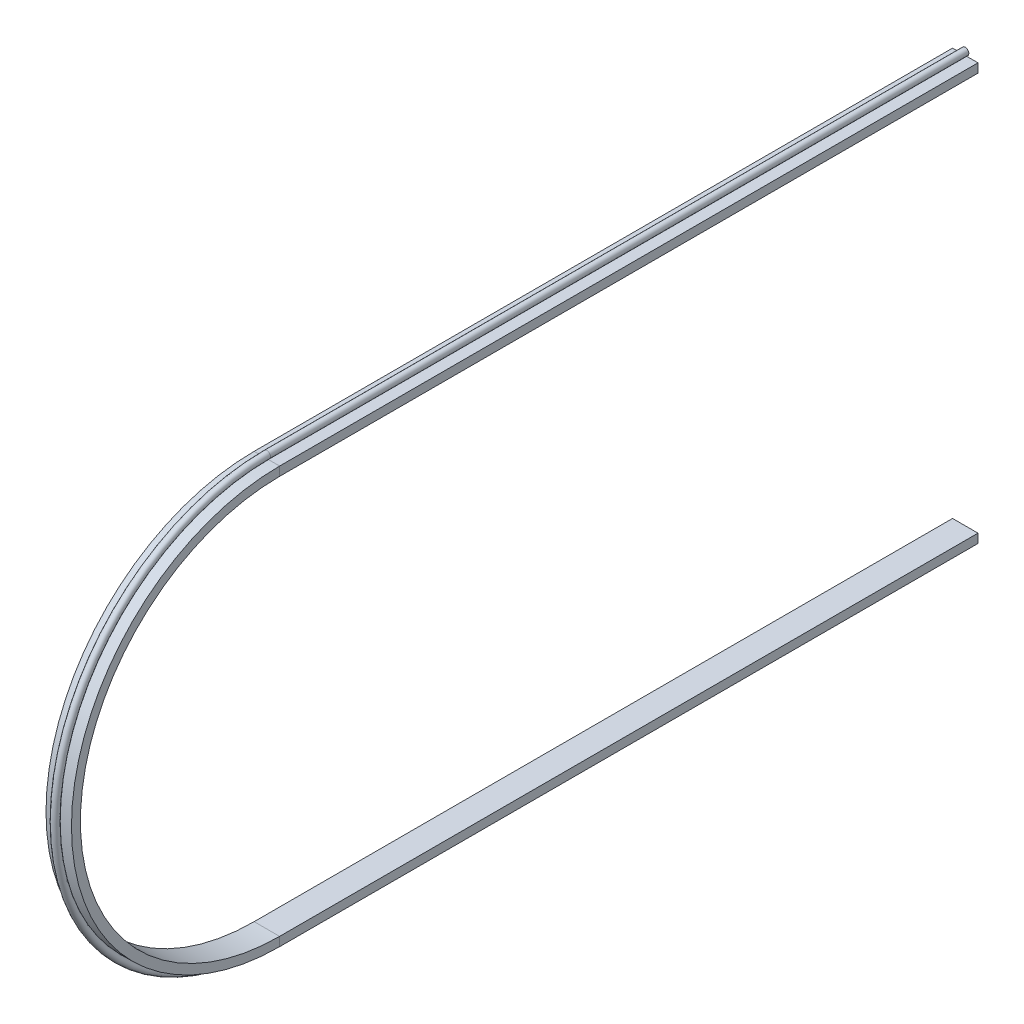
ISO-10303-21;
HEADER;
FILE_DESCRIPTION(('STEP AP214'),'2;1');
FILE_NAME('part.step','',(''),(''),'','','');
FILE_SCHEMA(('AUTOMOTIVE_DESIGN { 1 0 10303 214 1 1 1 1 }'));
ENDSEC;
DATA;
#1=APPLICATION_CONTEXT('core data for automotive mechanical design processes');
#2=APPLICATION_PROTOCOL_DEFINITION('international standard','automotive_design',2000,#1);
#3=PRODUCT_CONTEXT('',#1,'mechanical');
#4=PRODUCT('Part','Part','',(#3));
#5=PRODUCT_RELATED_PRODUCT_CATEGORY('part','',(#4));
#6=PRODUCT_DEFINITION_FORMATION('','',#4);
#7=PRODUCT_DEFINITION_CONTEXT('part definition',#1,'design');
#8=PRODUCT_DEFINITION('design','',#6,#7);
#9=PRODUCT_DEFINITION_SHAPE('','',#8);
#10=(LENGTH_UNIT() NAMED_UNIT(*) SI_UNIT(.MILLI.,.METRE.));
#11=(NAMED_UNIT(*) PLANE_ANGLE_UNIT() SI_UNIT($,.RADIAN.));
#12=(NAMED_UNIT(*) SI_UNIT($,.STERADIAN.) SOLID_ANGLE_UNIT());
#13=UNCERTAINTY_MEASURE_WITH_UNIT(LENGTH_MEASURE(1.E-05),#10,'distance_accuracy_value','');
#14=(GEOMETRIC_REPRESENTATION_CONTEXT(3) GLOBAL_UNCERTAINTY_ASSIGNED_CONTEXT((#13)) GLOBAL_UNIT_ASSIGNED_CONTEXT((#10,
#11,#12)) REPRESENTATION_CONTEXT('',''));
#15=CARTESIAN_POINT('',(0.,0.,0.));
#16=DIRECTION('',(0.,0.,1.));
#17=DIRECTION('',(1.,0.,0.));
#18=AXIS2_PLACEMENT_3D('',#15,#16,#17);
#19=CARTESIAN_POINT('',(0.,-3.95,0.));
#20=DIRECTION('',(0.,0.,1.));
#21=DIRECTION('',(1.,0.,0.));
#22=AXIS2_PLACEMENT_3D('',#19,#20,#21);
#23=PLANE('',#22);
#24=CARTESIAN_POINT('',(0.,-3.95,0.));
#25=DIRECTION('',(0.,0.,1.));
#26=DIRECTION('',(1.,0.,0.));
#27=AXIS2_PLACEMENT_3D('',#24,#25,#26);
#28=CIRCLE('',#27,1.75);
#29=CARTESIAN_POINT('',(1.75,-3.95,0.));
#30=VERTEX_POINT('',#29);
#31=EDGE_CURVE('E58',#30,#30,#28,.T.);
#32=ORIENTED_EDGE('',*,*,#31,.F.);
#33=EDGE_LOOP('',(#32));
#34=FACE_BOUND('',#33,.T.);
#35=ADVANCED_FACE('F44',(#34),#23,.F.);
#36=CARTESIAN_POINT('',(0.,203.95,0.));
#37=DIRECTION('',(0.,0.,-1.));
#38=DIRECTION('',(1.,0.,0.));
#39=AXIS2_PLACEMENT_3D('',#36,#37,#38);
#40=PLANE('',#39);
#41=CARTESIAN_POINT('',(0.,203.95,0.));
#42=DIRECTION('',(0.,0.,-1.));
#43=DIRECTION('',(1.,0.,0.));
#44=AXIS2_PLACEMENT_3D('',#41,#42,#43);
#45=CIRCLE('',#44,1.75);
#46=CARTESIAN_POINT('',(1.75,203.95,0.));
#47=VERTEX_POINT('',#46);
#48=EDGE_CURVE('E11',#47,#47,#45,.T.);
#49=ORIENTED_EDGE('',*,*,#48,.T.);
#50=EDGE_LOOP('',(#49));
#51=FACE_BOUND('',#50,.T.);
#52=ADVANCED_FACE('F67',(#51),#40,.T.);
#53=CARTESIAN_POINT('',(0.,-3.95,0.));
#54=DIRECTION('',(0.,0.,1.));
#55=DIRECTION('',(0.,-1.,0.));
#56=AXIS2_PLACEMENT_3D('',#53,#54,#55);
#57=CYLINDRICAL_SURFACE('',#56,1.75);
#58=CARTESIAN_POINT('',(0.,-3.95000000000004,342.92036732051));
#59=DIRECTION('',(0.,0.,1.));
#60=DIRECTION('',(1.,0.,0.));
#61=AXIS2_PLACEMENT_3D('',#58,#59,#60);
#62=CIRCLE('',#61,1.75);
#63=CARTESIAN_POINT('',(0.,-5.70000000000002,342.92036732051));
#64=VERTEX_POINT('',#63);
#65=EDGE_CURVE('E54',#64,#64,#62,.T.);
#66=ORIENTED_EDGE('',*,*,#65,.F.);
#67=EDGE_LOOP('',(#66));
#68=FACE_BOUND('',#67,.T.);
#69=ORIENTED_EDGE('',*,*,#31,.T.);
#70=EDGE_LOOP('',(#69));
#71=FACE_BOUND('',#70,.T.);
#72=ADVANCED_FACE('F64',(#68,#71),#57,.T.);
#73=CARTESIAN_POINT('',(0.,99.9999999999999,342.92036732051));
#74=DIRECTION('',(-1.,0.,0.));
#75=DIRECTION('',(0.,0.,1.));
#76=AXIS2_PLACEMENT_3D('',#73,#74,#75);
#77=TOROIDAL_SURFACE('',#76,103.95,1.75);
#78=CARTESIAN_POINT('',(0.,203.95,342.92036732051));
#79=DIRECTION('',(0.,0.,-1.));
#80=DIRECTION('',(1.,0.,0.));
#81=AXIS2_PLACEMENT_3D('',#78,#79,#80);
#82=CIRCLE('',#81,1.75);
#83=CARTESIAN_POINT('',(0.,205.7,342.92036732051));
#84=VERTEX_POINT('',#83);
#85=EDGE_CURVE('E50',#84,#84,#82,.T.);
#86=CARTESIAN_POINT('',(0.,99.9999999999999,342.92036732051));
#87=DIRECTION('',(-1.,0.,0.));
#88=DIRECTION('',(0.,0.,1.));
#89=AXIS2_PLACEMENT_3D('',#86,#87,#88);
#90=CIRCLE('',#89,105.7);
#91=EDGE_CURVE('',#64,#84,#90,.T.);
#92=ORIENTED_EDGE('',*,*,#65,.T.);
#93=ORIENTED_EDGE('',*,*,#85,.F.);
#94=ORIENTED_EDGE('',*,*,#91,.T.);
#95=ORIENTED_EDGE('',*,*,#91,.F.);
#96=EDGE_LOOP('',(#92,#94,#93,#95));
#97=FACE_BOUND('',#96,.T.);
#98=ADVANCED_FACE('F73',(#97),#77,.T.);
#99=CARTESIAN_POINT('',(0.,203.95,342.92036732051));
#100=DIRECTION('',(0.,0.,-1.));
#101=DIRECTION('',(0.,1.,0.));
#102=AXIS2_PLACEMENT_3D('',#99,#100,#101);
#103=CYLINDRICAL_SURFACE('',#102,1.75);
#104=ORIENTED_EDGE('',*,*,#48,.F.);
#105=EDGE_LOOP('',(#104));
#106=FACE_BOUND('',#105,.T.);
#107=ORIENTED_EDGE('',*,*,#85,.T.);
#108=EDGE_LOOP('',(#107));
#109=FACE_BOUND('',#108,.T.);
#110=ADVANCED_FACE('F71',(#106,#109),#103,.T.);
#111=CLOSED_SHELL('',(#35,#52,#72,#98,#110));
#112=MANIFOLD_SOLID_BREP('B2',#111);
#113=CARTESIAN_POINT('',(0.,0.,0.));
#114=DIRECTION('',(0.,0.,-1.));
#115=DIRECTION('',(-1.,0.,0.));
#116=AXIS2_PLACEMENT_3D('',#113,#114,#115);
#117=PLANE('',#116);
#118=DIRECTION('',(0.,1.,0.));
#119=VECTOR('',#118,1.);
#120=CARTESIAN_POINT('',(6.25,-2.2,0.));
#121=LINE('',#120,#119);
#122=CARTESIAN_POINT('',(6.25,-2.2,0.));
#123=VERTEX_POINT('',#122);
#124=CARTESIAN_POINT('',(6.25,2.2,0.));
#125=VERTEX_POINT('',#124);
#126=EDGE_CURVE('E211',#123,#125,#121,.T.);
#127=ORIENTED_EDGE('',*,*,#126,.F.);
#128=DIRECTION('',(1.,0.,0.));
#129=VECTOR('',#128,1.);
#130=CARTESIAN_POINT('',(-6.25,-2.2,0.));
#131=LINE('',#130,#129);
#132=CARTESIAN_POINT('',(-6.25,-2.2,0.));
#133=VERTEX_POINT('',#132);
#134=EDGE_CURVE('E198',#133,#123,#131,.T.);
#135=ORIENTED_EDGE('',*,*,#134,.F.);
#136=DIRECTION('',(0.,-1.,0.));
#137=VECTOR('',#136,1.);
#138=CARTESIAN_POINT('',(-6.25,-2.2,0.));
#139=LINE('',#138,#137);
#140=CARTESIAN_POINT('',(-6.25,2.2,0.));
#141=VERTEX_POINT('',#140);
#142=EDGE_CURVE('E208',#141,#133,#139,.T.);
#143=ORIENTED_EDGE('',*,*,#142,.F.);
#144=DIRECTION('',(-1.,0.,0.));
#145=VECTOR('',#144,1.);
#146=CARTESIAN_POINT('',(-6.25,2.2,0.));
#147=LINE('',#146,#145);
#148=EDGE_CURVE('E213',#125,#141,#147,.T.);
#149=ORIENTED_EDGE('',*,*,#148,.F.);
#150=EDGE_LOOP('',(#127,#135,#143,#149));
#151=FACE_BOUND('',#150,.T.);
#152=ADVANCED_FACE('F114',(#151),#117,.T.);
#153=CARTESIAN_POINT('',(0.,200.,0.));
#154=DIRECTION('',(0.,0.,1.));
#155=DIRECTION('',(-1.,0.,0.));
#156=AXIS2_PLACEMENT_3D('',#153,#154,#155);
#157=PLANE('',#156);
#158=DIRECTION('',(0.,-1.,0.));
#159=VECTOR('',#158,1.);
#160=CARTESIAN_POINT('',(6.25,202.2,0.));
#161=LINE('',#160,#159);
#162=CARTESIAN_POINT('',(6.25,202.2,0.));
#163=VERTEX_POINT('',#162);
#164=CARTESIAN_POINT('',(6.25,197.8,0.));
#165=VERTEX_POINT('',#164);
#166=EDGE_CURVE('E236',#163,#165,#161,.T.);
#167=ORIENTED_EDGE('',*,*,#166,.T.);
#168=DIRECTION('',(-1.,0.,0.));
#169=VECTOR('',#168,1.);
#170=CARTESIAN_POINT('',(-6.25,197.8,0.));
#171=LINE('',#170,#169);
#172=CARTESIAN_POINT('',(-6.25,197.8,0.));
#173=VERTEX_POINT('',#172);
#174=EDGE_CURVE('E133',#165,#173,#171,.T.);
#175=ORIENTED_EDGE('',*,*,#174,.T.);
#176=DIRECTION('',(0.,1.,0.));
#177=VECTOR('',#176,1.);
#178=CARTESIAN_POINT('',(-6.25,202.2,0.));
#179=LINE('',#178,#177);
#180=CARTESIAN_POINT('',(-6.25,202.2,0.));
#181=VERTEX_POINT('',#180);
#182=EDGE_CURVE('E127',#173,#181,#179,.T.);
#183=ORIENTED_EDGE('',*,*,#182,.T.);
#184=DIRECTION('',(1.,0.,0.));
#185=VECTOR('',#184,1.);
#186=CARTESIAN_POINT('',(-6.25,202.2,0.));
#187=LINE('',#186,#185);
#188=EDGE_CURVE('E42',#181,#163,#187,.T.);
#189=ORIENTED_EDGE('',*,*,#188,.T.);
#190=EDGE_LOOP('',(#167,#175,#183,#189));
#191=FACE_BOUND('',#190,.T.);
#192=ADVANCED_FACE('F291',(#191),#157,.F.);
#193=CARTESIAN_POINT('',(6.25,-2.2,0.));
#194=DIRECTION('',(1.,0.,0.));
#195=DIRECTION('',(0.,0.,-1.));
#196=AXIS2_PLACEMENT_3D('',#193,#194,#195);
#197=PLANE('',#196);
#198=DIRECTION('',(0.,0.,1.));
#199=VECTOR('',#198,1.);
#200=CARTESIAN_POINT('',(6.25,2.2,0.));
#201=LINE('',#200,#199);
#202=CARTESIAN_POINT('',(6.25,2.19999999999996,342.92036732051));
#203=VERTEX_POINT('',#202);
#204=EDGE_CURVE('E223',#125,#203,#201,.T.);
#205=ORIENTED_EDGE('',*,*,#204,.T.);
#206=DIRECTION('',(0.,1.,0.));
#207=VECTOR('',#206,1.);
#208=CARTESIAN_POINT('',(6.25,-2.20000000000004,342.92036732051));
#209=LINE('',#208,#207);
#210=CARTESIAN_POINT('',(6.25,-2.20000000000004,342.92036732051));
#211=VERTEX_POINT('',#210);
#212=EDGE_CURVE('E221',#211,#203,#209,.T.);
#213=ORIENTED_EDGE('',*,*,#212,.F.);
#214=DIRECTION('',(0.,0.,1.));
#215=VECTOR('',#214,1.);
#216=CARTESIAN_POINT('',(6.25,-2.2,0.));
#217=LINE('',#216,#215);
#218=EDGE_CURVE('E203',#123,#211,#217,.T.);
#219=ORIENTED_EDGE('',*,*,#218,.F.);
#220=ORIENTED_EDGE('',*,*,#126,.T.);
#221=EDGE_LOOP('',(#205,#213,#219,#220));
#222=FACE_BOUND('',#221,.T.);
#223=ADVANCED_FACE('F219',(#222),#197,.T.);
#224=CARTESIAN_POINT('',(-6.25,2.2,0.));
#225=DIRECTION('',(0.,1.,0.));
#226=DIRECTION('',(0.,0.,1.));
#227=AXIS2_PLACEMENT_3D('',#224,#225,#226);
#228=PLANE('',#227);
#229=DIRECTION('',(0.,0.,1.));
#230=VECTOR('',#229,1.);
#231=CARTESIAN_POINT('',(-6.25,2.2,0.));
#232=LINE('',#231,#230);
#233=CARTESIAN_POINT('',(-6.25,2.19999999999996,342.92036732051));
#234=VERTEX_POINT('',#233);
#235=EDGE_CURVE('E246',#141,#234,#232,.T.);
#236=ORIENTED_EDGE('',*,*,#235,.T.);
#237=DIRECTION('',(-1.,0.,0.));
#238=VECTOR('',#237,1.);
#239=CARTESIAN_POINT('',(-6.25,2.19999999999996,342.92036732051));
#240=LINE('',#239,#238);
#241=EDGE_CURVE('E244',#203,#234,#240,.T.);
#242=ORIENTED_EDGE('',*,*,#241,.F.);
#243=ORIENTED_EDGE('',*,*,#204,.F.);
#244=ORIENTED_EDGE('',*,*,#148,.T.);
#245=EDGE_LOOP('',(#236,#242,#243,#244));
#246=FACE_BOUND('',#245,.T.);
#247=ADVANCED_FACE('F283',(#246),#228,.T.);
#248=CARTESIAN_POINT('',(-6.25,-2.2,0.));
#249=DIRECTION('',(-1.,0.,0.));
#250=DIRECTION('',(0.,0.,1.));
#251=AXIS2_PLACEMENT_3D('',#248,#249,#250);
#252=PLANE('',#251);
#253=DIRECTION('',(0.,0.,1.));
#254=VECTOR('',#253,1.);
#255=CARTESIAN_POINT('',(-6.25,-2.2,0.));
#256=LINE('',#255,#254);
#257=CARTESIAN_POINT('',(-6.25,-2.20000000000004,342.92036732051));
#258=VERTEX_POINT('',#257);
#259=EDGE_CURVE('E205',#133,#258,#256,.T.);
#260=ORIENTED_EDGE('',*,*,#259,.T.);
#261=DIRECTION('',(0.,-1.,0.));
#262=VECTOR('',#261,1.);
#263=CARTESIAN_POINT('',(-6.25,-2.20000000000004,342.92036732051));
#264=LINE('',#263,#262);
#265=EDGE_CURVE('E249',#234,#258,#264,.T.);
#266=ORIENTED_EDGE('',*,*,#265,.F.);
#267=ORIENTED_EDGE('',*,*,#235,.F.);
#268=ORIENTED_EDGE('',*,*,#142,.T.);
#269=EDGE_LOOP('',(#260,#266,#267,#268));
#270=FACE_BOUND('',#269,.T.);
#271=ADVANCED_FACE('F276',(#270),#252,.T.);
#272=CARTESIAN_POINT('',(-6.25,-2.2,0.));
#273=DIRECTION('',(0.,-1.,0.));
#274=DIRECTION('',(0.,0.,-1.));
#275=AXIS2_PLACEMENT_3D('',#272,#273,#274);
#276=PLANE('',#275);
#277=ORIENTED_EDGE('',*,*,#218,.T.);
#278=DIRECTION('',(1.,0.,0.));
#279=VECTOR('',#278,1.);
#280=CARTESIAN_POINT('',(-6.25,-2.20000000000004,342.92036732051));
#281=LINE('',#280,#279);
#282=EDGE_CURVE('E235',#258,#211,#281,.T.);
#283=ORIENTED_EDGE('',*,*,#282,.F.);
#284=ORIENTED_EDGE('',*,*,#259,.F.);
#285=ORIENTED_EDGE('',*,*,#134,.T.);
#286=EDGE_LOOP('',(#277,#283,#284,#285));
#287=FACE_BOUND('',#286,.T.);
#288=ADVANCED_FACE('F200',(#287),#276,.T.);
#289=CARTESIAN_POINT('',(6.25,-2.20000000000003,342.92036732051));
#290=DIRECTION('',(1.,0.,0.));
#291=DIRECTION('',(0.,0.,-1.));
#292=AXIS2_PLACEMENT_3D('',#289,#290,#291);
#293=PLANE('',#292);
#294=CARTESIAN_POINT('',(6.25,99.9999999999999,342.92036732051));
#295=DIRECTION('',(-1.,0.,0.));
#296=DIRECTION('',(0.,-1.,0.));
#297=AXIS2_PLACEMENT_3D('',#294,#295,#296);
#298=CIRCLE('',#297,97.8);
#299=CARTESIAN_POINT('',(6.25,197.8,342.92036732051));
#300=VERTEX_POINT('',#299);
#301=EDGE_CURVE('E186',#203,#300,#298,.T.);
#302=ORIENTED_EDGE('',*,*,#301,.T.);
#303=DIRECTION('',(0.,-1.,0.));
#304=VECTOR('',#303,1.);
#305=CARTESIAN_POINT('',(6.25,202.2,342.92036732051));
#306=LINE('',#305,#304);
#307=CARTESIAN_POINT('',(6.25,202.2,342.92036732051));
#308=VERTEX_POINT('',#307);
#309=EDGE_CURVE('E227',#308,#300,#306,.T.);
#310=ORIENTED_EDGE('',*,*,#309,.F.);
#311=CARTESIAN_POINT('',(6.25,99.9999999999999,342.92036732051));
#312=DIRECTION('',(-1.,0.,0.));
#313=DIRECTION('',(0.,-1.,0.));
#314=AXIS2_PLACEMENT_3D('',#311,#312,#313);
#315=CIRCLE('',#314,102.2);
#316=EDGE_CURVE('E230',#211,#308,#315,.T.);
#317=ORIENTED_EDGE('',*,*,#316,.F.);
#318=ORIENTED_EDGE('',*,*,#212,.T.);
#319=EDGE_LOOP('',(#302,#310,#317,#318));
#320=FACE_BOUND('',#319,.T.);
#321=ADVANCED_FACE('F273',(#320),#293,.T.);
#322=CARTESIAN_POINT('',(0.,99.9999999999999,342.92036732051));
#323=DIRECTION('',(-1.,0.,0.));
#324=DIRECTION('',(0.,0.,1.));
#325=AXIS2_PLACEMENT_3D('',#322,#323,#324);
#326=CYLINDRICAL_SURFACE('',#325,97.8);
#327=CARTESIAN_POINT('',(-6.25,99.9999999999999,342.92036732051));
#328=DIRECTION('',(-1.,0.,0.));
#329=DIRECTION('',(0.,-1.,0.));
#330=AXIS2_PLACEMENT_3D('',#327,#328,#329);
#331=CIRCLE('',#330,97.8);
#332=CARTESIAN_POINT('',(-6.25,197.8,342.92036732051));
#333=VERTEX_POINT('',#332);
#334=EDGE_CURVE('E180',#234,#333,#331,.T.);
#335=ORIENTED_EDGE('',*,*,#334,.T.);
#336=DIRECTION('',(-1.,0.,0.));
#337=VECTOR('',#336,1.);
#338=CARTESIAN_POINT('',(-6.25,197.8,342.92036732051));
#339=LINE('',#338,#337);
#340=EDGE_CURVE('E232',#300,#333,#339,.T.);
#341=ORIENTED_EDGE('',*,*,#340,.F.);
#342=ORIENTED_EDGE('',*,*,#301,.F.);
#343=ORIENTED_EDGE('',*,*,#241,.T.);
#344=EDGE_LOOP('',(#335,#341,#342,#343));
#345=FACE_BOUND('',#344,.T.);
#346=ADVANCED_FACE('F281',(#345),#326,.F.);
#347=CARTESIAN_POINT('',(-6.25,-2.20000000000003,342.92036732051));
#348=DIRECTION('',(-1.,0.,0.));
#349=DIRECTION('',(0.,0.,1.));
#350=AXIS2_PLACEMENT_3D('',#347,#348,#349);
#351=PLANE('',#350);
#352=CARTESIAN_POINT('',(-6.25,99.9999999999999,342.92036732051));
#353=DIRECTION('',(-1.,0.,0.));
#354=DIRECTION('',(0.,-1.,0.));
#355=AXIS2_PLACEMENT_3D('',#352,#353,#354);
#356=CIRCLE('',#355,102.2);
#357=CARTESIAN_POINT('',(-6.25,202.2,342.92036732051));
#358=VERTEX_POINT('',#357);
#359=EDGE_CURVE('E259',#258,#358,#356,.T.);
#360=ORIENTED_EDGE('',*,*,#359,.T.);
#361=DIRECTION('',(0.,1.,0.));
#362=VECTOR('',#361,1.);
#363=CARTESIAN_POINT('',(-6.25,202.2,342.92036732051));
#364=LINE('',#363,#362);
#365=EDGE_CURVE('E252',#333,#358,#364,.T.);
#366=ORIENTED_EDGE('',*,*,#365,.F.);
#367=ORIENTED_EDGE('',*,*,#334,.F.);
#368=ORIENTED_EDGE('',*,*,#265,.T.);
#369=EDGE_LOOP('',(#360,#366,#367,#368));
#370=FACE_BOUND('',#369,.T.);
#371=ADVANCED_FACE('F278',(#370),#351,.T.);
#372=CARTESIAN_POINT('',(0.,99.9999999999999,342.92036732051));
#373=DIRECTION('',(-1.,0.,0.));
#374=DIRECTION('',(0.,0.,1.));
#375=AXIS2_PLACEMENT_3D('',#372,#373,#374);
#376=CYLINDRICAL_SURFACE('',#375,102.2);
#377=ORIENTED_EDGE('',*,*,#316,.T.);
#378=DIRECTION('',(1.,0.,0.));
#379=VECTOR('',#378,1.);
#380=CARTESIAN_POINT('',(-6.25,202.2,342.92036732051));
#381=LINE('',#380,#379);
#382=EDGE_CURVE('E242',#358,#308,#381,.T.);
#383=ORIENTED_EDGE('',*,*,#382,.F.);
#384=ORIENTED_EDGE('',*,*,#359,.F.);
#385=ORIENTED_EDGE('',*,*,#282,.T.);
#386=EDGE_LOOP('',(#377,#383,#384,#385));
#387=FACE_BOUND('',#386,.T.);
#388=ADVANCED_FACE('F274',(#387),#376,.T.);
#389=CARTESIAN_POINT('',(6.25,202.2,342.92036732051));
#390=DIRECTION('',(1.,0.,0.));
#391=DIRECTION('',(0.,0.,-1.));
#392=AXIS2_PLACEMENT_3D('',#389,#390,#391);
#393=PLANE('',#392);
#394=DIRECTION('',(0.,0.,-1.));
#395=VECTOR('',#394,1.);
#396=CARTESIAN_POINT('',(6.25,197.8,342.92036732051));
#397=LINE('',#396,#395);
#398=EDGE_CURVE('E168',#300,#165,#397,.T.);
#399=ORIENTED_EDGE('',*,*,#398,.T.);
#400=ORIENTED_EDGE('',*,*,#166,.F.);
#401=DIRECTION('',(0.,0.,-1.));
#402=VECTOR('',#401,1.);
#403=CARTESIAN_POINT('',(6.25,202.2,342.92036732051));
#404=LINE('',#403,#402);
#405=EDGE_CURVE('E238',#308,#163,#404,.T.);
#406=ORIENTED_EDGE('',*,*,#405,.F.);
#407=ORIENTED_EDGE('',*,*,#309,.T.);
#408=EDGE_LOOP('',(#399,#400,#406,#407));
#409=FACE_BOUND('',#408,.T.);
#410=ADVANCED_FACE('F270',(#409),#393,.T.);
#411=CARTESIAN_POINT('',(-6.25,197.8,342.92036732051));
#412=DIRECTION('',(0.,-1.,0.));
#413=DIRECTION('',(0.,0.,-1.));
#414=AXIS2_PLACEMENT_3D('',#411,#412,#413);
#415=PLANE('',#414);
#416=DIRECTION('',(0.,0.,-1.));
#417=VECTOR('',#416,1.);
#418=CARTESIAN_POINT('',(-6.25,197.8,342.92036732051));
#419=LINE('',#418,#417);
#420=EDGE_CURVE('E161',#333,#173,#419,.T.);
#421=ORIENTED_EDGE('',*,*,#420,.T.);
#422=ORIENTED_EDGE('',*,*,#174,.F.);
#423=ORIENTED_EDGE('',*,*,#398,.F.);
#424=ORIENTED_EDGE('',*,*,#340,.T.);
#425=EDGE_LOOP('',(#421,#422,#423,#424));
#426=FACE_BOUND('',#425,.T.);
#427=ADVANCED_FACE('F280',(#426),#415,.T.);
#428=CARTESIAN_POINT('',(-6.25,202.2,342.92036732051));
#429=DIRECTION('',(-1.,0.,0.));
#430=DIRECTION('',(0.,0.,1.));
#431=AXIS2_PLACEMENT_3D('',#428,#429,#430);
#432=PLANE('',#431);
#433=DIRECTION('',(0.,0.,-1.));
#434=VECTOR('',#433,1.);
#435=CARTESIAN_POINT('',(-6.25,202.2,342.92036732051));
#436=LINE('',#435,#434);
#437=EDGE_CURVE('E121',#358,#181,#436,.T.);
#438=ORIENTED_EDGE('',*,*,#437,.T.);
#439=ORIENTED_EDGE('',*,*,#182,.F.);
#440=ORIENTED_EDGE('',*,*,#420,.F.);
#441=ORIENTED_EDGE('',*,*,#365,.T.);
#442=EDGE_LOOP('',(#438,#439,#440,#441));
#443=FACE_BOUND('',#442,.T.);
#444=ADVANCED_FACE('F279',(#443),#432,.T.);
#445=CARTESIAN_POINT('',(-6.25,202.2,342.92036732051));
#446=DIRECTION('',(0.,1.,0.));
#447=DIRECTION('',(0.,0.,1.));
#448=AXIS2_PLACEMENT_3D('',#445,#446,#447);
#449=PLANE('',#448);
#450=ORIENTED_EDGE('',*,*,#405,.T.);
#451=ORIENTED_EDGE('',*,*,#188,.F.);
#452=ORIENTED_EDGE('',*,*,#437,.F.);
#453=ORIENTED_EDGE('',*,*,#382,.T.);
#454=EDGE_LOOP('',(#450,#451,#452,#453));
#455=FACE_BOUND('',#454,.T.);
#456=ADVANCED_FACE('F265',(#455),#449,.T.);
#457=CLOSED_SHELL('',(#152,#192,#223,#247,#271,#288,#321,#346,#371,#388,#410,#427,#444,#456));
#458=MANIFOLD_SOLID_BREP('B6',#457);
#459=ADVANCED_BREP_SHAPE_REPRESENTATION('',(#18,#112,#458),#14);
#460=SHAPE_DEFINITION_REPRESENTATION(#9,#459);
ENDSEC;
END-ISO-10303-21;
